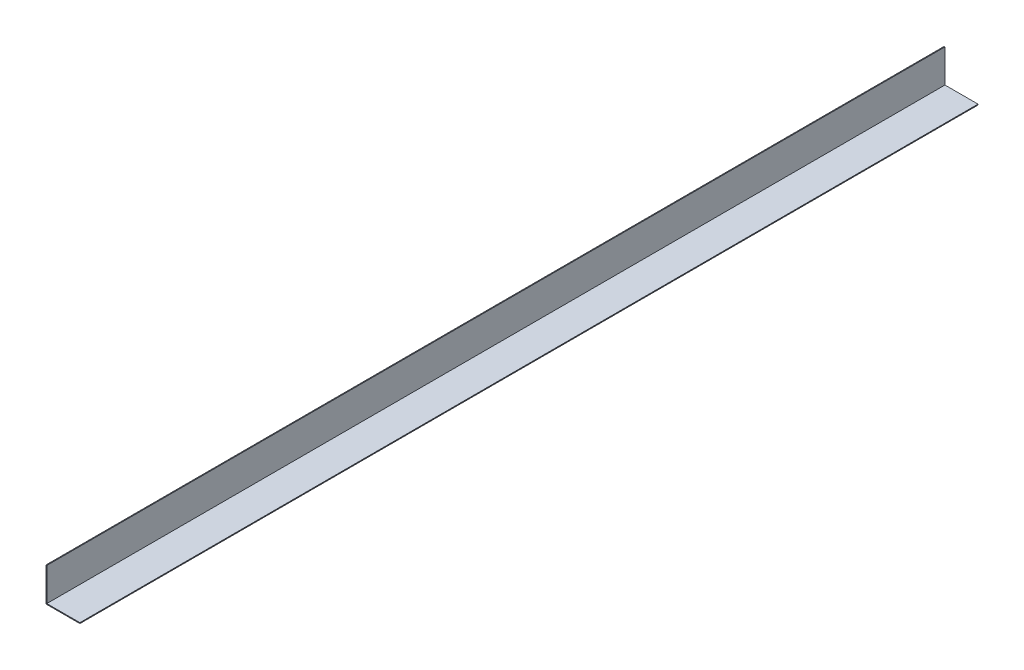
ISO-10303-21;
HEADER;
FILE_DESCRIPTION(('STEP AP214'),'2;1');
FILE_NAME('part.step','',(''),(''),'','','');
FILE_SCHEMA(('AUTOMOTIVE_DESIGN { 1 0 10303 214 1 1 1 1 }'));
ENDSEC;
DATA;
#1=APPLICATION_CONTEXT('core data for automotive mechanical design processes');
#2=APPLICATION_PROTOCOL_DEFINITION('international standard','automotive_design',2000,#1);
#3=PRODUCT_CONTEXT('',#1,'mechanical');
#4=PRODUCT('Part','Part','',(#3));
#5=PRODUCT_RELATED_PRODUCT_CATEGORY('part','',(#4));
#6=PRODUCT_DEFINITION_FORMATION('','',#4);
#7=PRODUCT_DEFINITION_CONTEXT('part definition',#1,'design');
#8=PRODUCT_DEFINITION('design','',#6,#7);
#9=PRODUCT_DEFINITION_SHAPE('','',#8);
#10=(LENGTH_UNIT() NAMED_UNIT(*) SI_UNIT(.MILLI.,.METRE.));
#11=(NAMED_UNIT(*) PLANE_ANGLE_UNIT() SI_UNIT($,.RADIAN.));
#12=(NAMED_UNIT(*) SI_UNIT($,.STERADIAN.) SOLID_ANGLE_UNIT());
#13=UNCERTAINTY_MEASURE_WITH_UNIT(LENGTH_MEASURE(1.E-05),#10,'distance_accuracy_value','');
#14=(GEOMETRIC_REPRESENTATION_CONTEXT(3) GLOBAL_UNCERTAINTY_ASSIGNED_CONTEXT((#13)) GLOBAL_UNIT_ASSIGNED_CONTEXT((#10,
#11,#12)) REPRESENTATION_CONTEXT('',''));
#15=CARTESIAN_POINT('',(0.,0.,0.));
#16=DIRECTION('',(0.,0.,1.));
#17=DIRECTION('',(1.,0.,0.));
#18=AXIS2_PLACEMENT_3D('',#15,#16,#17);
#19=CARTESIAN_POINT('',(-40.,0.,0.));
#20=DIRECTION('',(0.,0.,-1.));
#21=DIRECTION('',(0.,1.,0.));
#22=AXIS2_PLACEMENT_3D('',#19,#20,#21);
#23=PLANE('',#22);
#24=DIRECTION('',(0.,1.,0.));
#25=VECTOR('',#24,1.);
#26=CARTESIAN_POINT('',(-39.,0.,0.));
#27=LINE('',#26,#25);
#28=CARTESIAN_POINT('',(-39.,0.999999999999995,0.));
#29=VERTEX_POINT('',#28);
#30=CARTESIAN_POINT('',(-38.9999999999999,40.,0.));
#31=VERTEX_POINT('',#30);
#32=EDGE_CURVE('E128',#29,#31,#27,.T.);
#33=ORIENTED_EDGE('',*,*,#32,.F.);
#34=DIRECTION('',(-1.,0.,0.));
#35=VECTOR('',#34,1.);
#36=CARTESIAN_POINT('',(0.,1.,0.));
#37=LINE('',#36,#35);
#38=CARTESIAN_POINT('',(0.,1.,0.));
#39=VERTEX_POINT('',#38);
#40=EDGE_CURVE('E124',#39,#29,#37,.T.);
#41=ORIENTED_EDGE('',*,*,#40,.F.);
#42=DIRECTION('',(0.,1.,0.));
#43=VECTOR('',#42,1.);
#44=CARTESIAN_POINT('',(0.,0.,0.));
#45=LINE('',#44,#43);
#46=CARTESIAN_POINT('',(0.,0.,0.));
#47=VERTEX_POINT('',#46);
#48=EDGE_CURVE('E11',#47,#39,#45,.T.);
#49=ORIENTED_EDGE('',*,*,#48,.F.);
#50=DIRECTION('',(-1.,0.,0.));
#51=VECTOR('',#50,1.);
#52=CARTESIAN_POINT('',(0.,0.,0.));
#53=LINE('',#52,#51);
#54=CARTESIAN_POINT('',(-40.,0.,0.));
#55=VERTEX_POINT('',#54);
#56=EDGE_CURVE('E111',#47,#55,#53,.T.);
#57=ORIENTED_EDGE('',*,*,#56,.T.);
#58=DIRECTION('',(0.,1.,0.));
#59=VECTOR('',#58,1.);
#60=CARTESIAN_POINT('',(-40.,0.,0.));
#61=LINE('',#60,#59);
#62=CARTESIAN_POINT('',(-39.9999999999999,40.,0.));
#63=VERTEX_POINT('',#62);
#64=EDGE_CURVE('E103',#55,#63,#61,.T.);
#65=ORIENTED_EDGE('',*,*,#64,.T.);
#66=DIRECTION('',(1.,0.,0.));
#67=VECTOR('',#66,1.);
#68=CARTESIAN_POINT('',(-39.9999999999999,40.,0.));
#69=LINE('',#68,#67);
#70=EDGE_CURVE('E43',#63,#31,#69,.T.);
#71=ORIENTED_EDGE('',*,*,#70,.T.);
#72=EDGE_LOOP('',(#33,#41,#49,#57,#65,#71));
#73=FACE_BOUND('',#72,.T.);
#74=ADVANCED_FACE('F33',(#73),#23,.T.);
#75=CARTESIAN_POINT('',(-39.9999999999999,40.,0.));
#76=DIRECTION('',(0.,1.,0.));
#77=DIRECTION('',(0.,0.,1.));
#78=AXIS2_PLACEMENT_3D('',#75,#76,#77);
#79=PLANE('',#78);
#80=ORIENTED_EDGE('',*,*,#70,.F.);
#81=DIRECTION('',(0.,0.,1.));
#82=VECTOR('',#81,1.);
#83=CARTESIAN_POINT('',(-39.9999999999999,40.,0.));
#84=LINE('',#83,#82);
#85=CARTESIAN_POINT('',(-39.9999999999999,40.,1060.));
#86=VERTEX_POINT('',#85);
#87=EDGE_CURVE('E99',#63,#86,#84,.T.);
#88=ORIENTED_EDGE('',*,*,#87,.T.);
#89=DIRECTION('',(1.,0.,0.));
#90=VECTOR('',#89,1.);
#91=CARTESIAN_POINT('',(-39.9999999999999,40.,1060.));
#92=LINE('',#91,#90);
#93=CARTESIAN_POINT('',(-38.9999999999999,40.,1060.));
#94=VERTEX_POINT('',#93);
#95=EDGE_CURVE('E85',#86,#94,#92,.T.);
#96=ORIENTED_EDGE('',*,*,#95,.T.);
#97=DIRECTION('',(0.,0.,1.));
#98=VECTOR('',#97,1.);
#99=CARTESIAN_POINT('',(-38.9999999999999,40.,0.));
#100=LINE('',#99,#98);
#101=EDGE_CURVE('E130',#31,#94,#100,.T.);
#102=ORIENTED_EDGE('',*,*,#101,.F.);
#103=EDGE_LOOP('',(#80,#88,#96,#102));
#104=FACE_BOUND('',#103,.T.);
#105=ADVANCED_FACE('F101',(#104),#79,.T.);
#106=CARTESIAN_POINT('',(0.,0.,1060.));
#107=DIRECTION('',(0.,0.,-1.));
#108=DIRECTION('',(-1.,0.,0.));
#109=AXIS2_PLACEMENT_3D('',#106,#107,#108);
#110=PLANE('',#109);
#111=DIRECTION('',(-1.,0.,0.));
#112=VECTOR('',#111,1.);
#113=CARTESIAN_POINT('',(0.,1.,1060.));
#114=LINE('',#113,#112);
#115=CARTESIAN_POINT('',(0.,1.,1060.));
#116=VERTEX_POINT('',#115);
#117=CARTESIAN_POINT('',(-39.,0.999999999999995,1060.));
#118=VERTEX_POINT('',#117);
#119=EDGE_CURVE('E125',#116,#118,#114,.T.);
#120=ORIENTED_EDGE('',*,*,#119,.T.);
#121=DIRECTION('',(0.,1.,0.));
#122=VECTOR('',#121,1.);
#123=CARTESIAN_POINT('',(-39.,0.,1060.));
#124=LINE('',#123,#122);
#125=EDGE_CURVE('E91',#118,#94,#124,.T.);
#126=ORIENTED_EDGE('',*,*,#125,.T.);
#127=ORIENTED_EDGE('',*,*,#95,.F.);
#128=DIRECTION('',(0.,1.,0.));
#129=VECTOR('',#128,1.);
#130=CARTESIAN_POINT('',(-40.,0.,1060.));
#131=LINE('',#130,#129);
#132=CARTESIAN_POINT('',(-40.,0.,1060.));
#133=VERTEX_POINT('',#132);
#134=EDGE_CURVE('E89',#133,#86,#131,.T.);
#135=ORIENTED_EDGE('',*,*,#134,.F.);
#136=DIRECTION('',(-1.,0.,0.));
#137=VECTOR('',#136,1.);
#138=CARTESIAN_POINT('',(0.,0.,1060.));
#139=LINE('',#138,#137);
#140=CARTESIAN_POINT('',(0.,0.,1060.));
#141=VERTEX_POINT('',#140);
#142=EDGE_CURVE('E102',#141,#133,#139,.T.);
#143=ORIENTED_EDGE('',*,*,#142,.F.);
#144=DIRECTION('',(0.,1.,0.));
#145=VECTOR('',#144,1.);
#146=CARTESIAN_POINT('',(0.,0.,1060.));
#147=LINE('',#146,#145);
#148=EDGE_CURVE('E37',#141,#116,#147,.T.);
#149=ORIENTED_EDGE('',*,*,#148,.T.);
#150=EDGE_LOOP('',(#120,#126,#127,#135,#143,#149));
#151=FACE_BOUND('',#150,.T.);
#152=ADVANCED_FACE('F87',(#151),#110,.F.);
#153=CARTESIAN_POINT('',(0.,0.,0.));
#154=DIRECTION('',(-1.,0.,0.));
#155=DIRECTION('',(0.,0.,1.));
#156=AXIS2_PLACEMENT_3D('',#153,#154,#155);
#157=PLANE('',#156);
#158=DIRECTION('',(0.,0.,1.));
#159=VECTOR('',#158,1.);
#160=CARTESIAN_POINT('',(0.,0.,0.));
#161=LINE('',#160,#159);
#162=EDGE_CURVE('E105',#47,#141,#161,.T.);
#163=ORIENTED_EDGE('',*,*,#162,.F.);
#164=ORIENTED_EDGE('',*,*,#48,.T.);
#165=DIRECTION('',(0.,0.,1.));
#166=VECTOR('',#165,1.);
#167=CARTESIAN_POINT('',(0.,1.,0.));
#168=LINE('',#167,#166);
#169=EDGE_CURVE('E121',#39,#116,#168,.T.);
#170=ORIENTED_EDGE('',*,*,#169,.T.);
#171=ORIENTED_EDGE('',*,*,#148,.F.);
#172=EDGE_LOOP('',(#163,#164,#170,#171));
#173=FACE_BOUND('',#172,.T.);
#174=ADVANCED_FACE('F35',(#173),#157,.F.);
#175=CARTESIAN_POINT('',(0.,1.,0.));
#176=DIRECTION('',(0.,1.,0.));
#177=DIRECTION('',(-1.,0.,0.));
#178=AXIS2_PLACEMENT_3D('',#175,#176,#177);
#179=PLANE('',#178);
#180=ORIENTED_EDGE('',*,*,#119,.F.);
#181=ORIENTED_EDGE('',*,*,#169,.F.);
#182=ORIENTED_EDGE('',*,*,#40,.T.);
#183=DIRECTION('',(0.,0.,1.));
#184=VECTOR('',#183,1.);
#185=CARTESIAN_POINT('',(-39.,0.999999999999995,0.));
#186=LINE('',#185,#184);
#187=EDGE_CURVE('E118',#29,#118,#186,.T.);
#188=ORIENTED_EDGE('',*,*,#187,.T.);
#189=EDGE_LOOP('',(#180,#181,#182,#188));
#190=FACE_BOUND('',#189,.T.);
#191=ADVANCED_FACE('F137',(#190),#179,.T.);
#192=CARTESIAN_POINT('',(-39.,0.,0.));
#193=DIRECTION('',(1.,0.,0.));
#194=DIRECTION('',(0.,1.,0.));
#195=AXIS2_PLACEMENT_3D('',#192,#193,#194);
#196=PLANE('',#195);
#197=ORIENTED_EDGE('',*,*,#125,.F.);
#198=ORIENTED_EDGE('',*,*,#187,.F.);
#199=ORIENTED_EDGE('',*,*,#32,.T.);
#200=ORIENTED_EDGE('',*,*,#101,.T.);
#201=EDGE_LOOP('',(#197,#198,#199,#200));
#202=FACE_BOUND('',#201,.T.);
#203=ADVANCED_FACE('F141',(#202),#196,.T.);
#204=CARTESIAN_POINT('',(0.,0.,0.));
#205=DIRECTION('',(0.,1.,0.));
#206=DIRECTION('',(-1.,0.,0.));
#207=AXIS2_PLACEMENT_3D('',#204,#205,#206);
#208=PLANE('',#207);
#209=ORIENTED_EDGE('',*,*,#142,.T.);
#210=DIRECTION('',(0.,0.,1.));
#211=VECTOR('',#210,1.);
#212=CARTESIAN_POINT('',(-40.,0.,0.));
#213=LINE('',#212,#211);
#214=EDGE_CURVE('E78',#55,#133,#213,.T.);
#215=ORIENTED_EDGE('',*,*,#214,.F.);
#216=ORIENTED_EDGE('',*,*,#56,.F.);
#217=ORIENTED_EDGE('',*,*,#162,.T.);
#218=EDGE_LOOP('',(#209,#215,#216,#217));
#219=FACE_BOUND('',#218,.T.);
#220=ADVANCED_FACE('F151',(#219),#208,.F.);
#221=CARTESIAN_POINT('',(-40.,0.,0.));
#222=DIRECTION('',(1.,0.,0.));
#223=DIRECTION('',(0.,1.,0.));
#224=AXIS2_PLACEMENT_3D('',#221,#222,#223);
#225=PLANE('',#224);
#226=ORIENTED_EDGE('',*,*,#134,.T.);
#227=ORIENTED_EDGE('',*,*,#87,.F.);
#228=ORIENTED_EDGE('',*,*,#64,.F.);
#229=ORIENTED_EDGE('',*,*,#214,.T.);
#230=EDGE_LOOP('',(#226,#227,#228,#229));
#231=FACE_BOUND('',#230,.T.);
#232=ADVANCED_FACE('F98',(#231),#225,.F.);
#233=CLOSED_SHELL('',(#74,#105,#152,#174,#191,#203,#220,#232));
#234=MANIFOLD_SOLID_BREP('B2',#233);
#235=ADVANCED_BREP_SHAPE_REPRESENTATION('',(#18,#234),#14);
#236=SHAPE_DEFINITION_REPRESENTATION(#9,#235);
ENDSEC;
END-ISO-10303-21;
